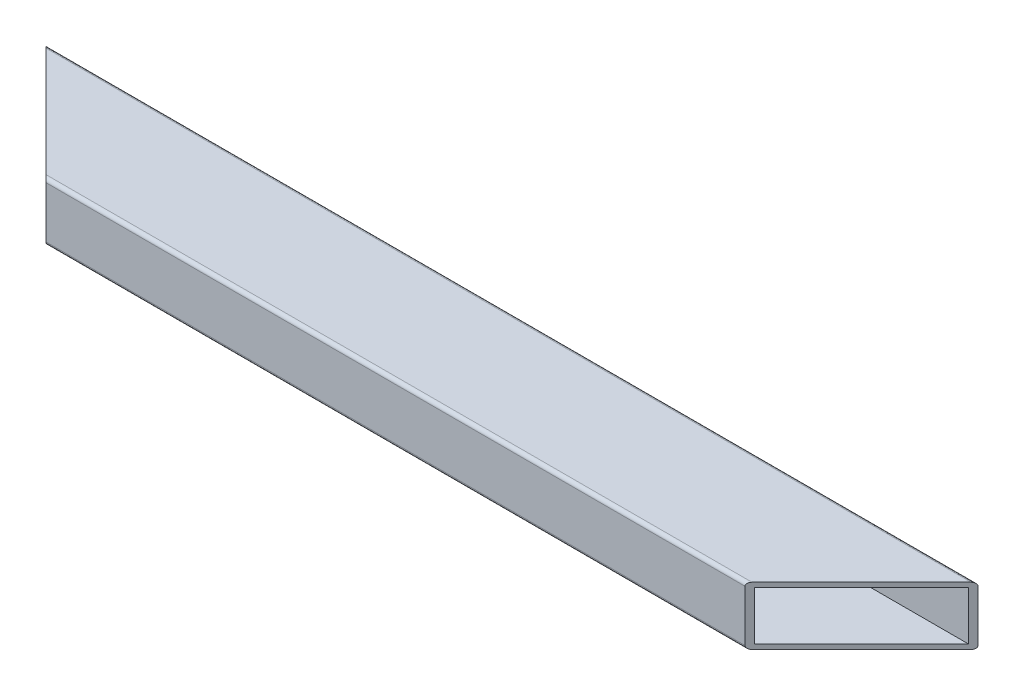
ISO-10303-21;
HEADER;
FILE_DESCRIPTION(('STEP AP214'),'2;1');
FILE_NAME('part.step','',(''),(''),'','','');
FILE_SCHEMA(('AUTOMOTIVE_DESIGN { 1 0 10303 214 1 1 1 1 }'));
ENDSEC;
DATA;
#1=APPLICATION_CONTEXT('core data for automotive mechanical design processes');
#2=APPLICATION_PROTOCOL_DEFINITION('international standard','automotive_design',2000,#1);
#3=PRODUCT_CONTEXT('',#1,'mechanical');
#4=PRODUCT('Part','Part','',(#3));
#5=PRODUCT_RELATED_PRODUCT_CATEGORY('part','',(#4));
#6=PRODUCT_DEFINITION_FORMATION('','',#4);
#7=PRODUCT_DEFINITION_CONTEXT('part definition',#1,'design');
#8=PRODUCT_DEFINITION('design','',#6,#7);
#9=PRODUCT_DEFINITION_SHAPE('','',#8);
#10=(LENGTH_UNIT() NAMED_UNIT(*) SI_UNIT(.MILLI.,.METRE.));
#11=(NAMED_UNIT(*) PLANE_ANGLE_UNIT() SI_UNIT($,.RADIAN.));
#12=(NAMED_UNIT(*) SI_UNIT($,.STERADIAN.) SOLID_ANGLE_UNIT());
#13=UNCERTAINTY_MEASURE_WITH_UNIT(LENGTH_MEASURE(1.E-05),#10,'distance_accuracy_value','');
#14=(GEOMETRIC_REPRESENTATION_CONTEXT(3) GLOBAL_UNCERTAINTY_ASSIGNED_CONTEXT((#13)) GLOBAL_UNIT_ASSIGNED_CONTEXT((#10,
#11,#12)) REPRESENTATION_CONTEXT('',''));
#15=CARTESIAN_POINT('',(0.,0.,0.));
#16=DIRECTION('',(0.,0.,1.));
#17=DIRECTION('',(1.,0.,0.));
#18=AXIS2_PLACEMENT_3D('',#15,#16,#17);
#19=CARTESIAN_POINT('',(762.,-11.,23.5));
#20=DIRECTION('',(-1.,0.,0.));
#21=DIRECTION('',(0.,0.,1.));
#22=AXIS2_PLACEMENT_3D('',#19,#20,#21);
#23=CYLINDRICAL_SURFACE('',#22,1.5);
#24=DIRECTION('',(-1.,0.,0.));
#25=VECTOR('',#24,1.);
#26=CARTESIAN_POINT('',(762.,-12.5,23.5));
#27=LINE('',#26,#25);
#28=CARTESIAN_POINT('',(151.499999999999,-12.5,23.5));
#29=VERTEX_POINT('',#28);
#30=CARTESIAN_POINT('',(-151.5,-12.5,23.4999999999999));
#31=VERTEX_POINT('',#30);
#32=EDGE_CURVE('E218',#29,#31,#27,.T.);
#33=ORIENTED_EDGE('',*,*,#32,.F.);
#34=CARTESIAN_POINT('',(151.499999999999,-11.,23.5));
#35=DIRECTION('',(-0.707106781186544,0.,-0.707106781186551));
#36=DIRECTION('',(-0.707106781186551,0.,0.707106781186544));
#37=AXIS2_PLACEMENT_3D('',#34,#35,#36);
#38=ELLIPSE('',#37,2.12132034355965,1.5);
#39=CARTESIAN_POINT('',(149.999999999999,-11.,25.));
#40=VERTEX_POINT('',#39);
#41=EDGE_CURVE('E165',#29,#40,#38,.T.);
#42=ORIENTED_EDGE('',*,*,#41,.T.);
#43=DIRECTION('',(-1.,0.,0.));
#44=VECTOR('',#43,1.);
#45=CARTESIAN_POINT('',(762.,-11.,25.));
#46=LINE('',#45,#44);
#47=CARTESIAN_POINT('',(-150.,-11.,25.));
#48=VERTEX_POINT('',#47);
#49=EDGE_CURVE('E203',#40,#48,#46,.T.);
#50=ORIENTED_EDGE('',*,*,#49,.T.);
#51=CARTESIAN_POINT('',(-151.5,-11.,23.5));
#52=DIRECTION('',(-0.707106781186544,0.,0.707106781186551));
#53=DIRECTION('',(-0.707106781186551,0.,-0.707106781186544));
#54=AXIS2_PLACEMENT_3D('',#51,#52,#53);
#55=ELLIPSE('',#54,2.12132034355965,1.5);
#56=EDGE_CURVE('E133',#31,#48,#55,.T.);
#57=ORIENTED_EDGE('',*,*,#56,.F.);
#58=EDGE_LOOP('',(#33,#42,#50,#57));
#59=FACE_BOUND('',#58,.T.);
#60=ADVANCED_FACE('F37',(#59),#23,.T.);
#61=CARTESIAN_POINT('',(762.,-12.5,23.5));
#62=DIRECTION('',(0.,1.,0.));
#63=DIRECTION('',(0.,0.,1.));
#64=AXIS2_PLACEMENT_3D('',#61,#62,#63);
#65=PLANE('',#64);
#66=DIRECTION('',(-1.,0.,0.));
#67=VECTOR('',#66,1.);
#68=CARTESIAN_POINT('',(762.,-12.5,-23.5));
#69=LINE('',#68,#67);
#70=CARTESIAN_POINT('',(198.5,-12.5,-23.5));
#71=VERTEX_POINT('',#70);
#72=CARTESIAN_POINT('',(-198.5,-12.5,-23.5));
#73=VERTEX_POINT('',#72);
#74=EDGE_CURVE('E216',#71,#73,#69,.T.);
#75=ORIENTED_EDGE('',*,*,#74,.F.);
#76=DIRECTION('',(-0.707106781186551,0.,0.707106781186544));
#77=VECTOR('',#76,1.);
#78=CARTESIAN_POINT('',(456.750000000003,-12.5,-281.75));
#79=LINE('',#78,#77);
#80=EDGE_CURVE('E162',#71,#29,#79,.T.);
#81=ORIENTED_EDGE('',*,*,#80,.T.);
#82=ORIENTED_EDGE('',*,*,#32,.T.);
#83=DIRECTION('',(0.707106781186551,0.,0.707106781186544));
#84=VECTOR('',#83,1.);
#85=CARTESIAN_POINT('',(305.250000000005,-12.5,480.25));
#86=LINE('',#85,#84);
#87=EDGE_CURVE('E194',#73,#31,#86,.T.);
#88=ORIENTED_EDGE('',*,*,#87,.F.);
#89=EDGE_LOOP('',(#75,#81,#82,#88));
#90=FACE_BOUND('',#89,.T.);
#91=ADVANCED_FACE('F224',(#90),#65,.F.);
#92=CARTESIAN_POINT('',(762.,-11.,-23.5));
#93=DIRECTION('',(-1.,0.,0.));
#94=DIRECTION('',(0.,0.,1.));
#95=AXIS2_PLACEMENT_3D('',#92,#93,#94);
#96=CYLINDRICAL_SURFACE('',#95,1.5);
#97=DIRECTION('',(-1.,0.,0.));
#98=VECTOR('',#97,1.);
#99=CARTESIAN_POINT('',(762.,-11.,-25.));
#100=LINE('',#99,#98);
#101=CARTESIAN_POINT('',(200.,-11.,-25.));
#102=VERTEX_POINT('',#101);
#103=CARTESIAN_POINT('',(-200.,-11.,-25.));
#104=VERTEX_POINT('',#103);
#105=EDGE_CURVE('E214',#102,#104,#100,.T.);
#106=ORIENTED_EDGE('',*,*,#105,.F.);
#107=CARTESIAN_POINT('',(198.5,-11.,-23.5));
#108=DIRECTION('',(-0.707106781186544,0.,-0.707106781186551));
#109=DIRECTION('',(-0.707106781186551,0.,0.707106781186544));
#110=AXIS2_PLACEMENT_3D('',#107,#108,#109);
#111=ELLIPSE('',#110,2.12132034355965,1.5);
#112=EDGE_CURVE('E159',#102,#71,#111,.T.);
#113=ORIENTED_EDGE('',*,*,#112,.T.);
#114=ORIENTED_EDGE('',*,*,#74,.T.);
#115=CARTESIAN_POINT('',(-198.5,-11.,-23.5));
#116=DIRECTION('',(-0.707106781186544,0.,0.707106781186551));
#117=DIRECTION('',(-0.707106781186551,0.,-0.707106781186544));
#118=AXIS2_PLACEMENT_3D('',#115,#116,#117);
#119=ELLIPSE('',#118,2.12132034355965,1.5);
#120=EDGE_CURVE('E191',#104,#73,#119,.T.);
#121=ORIENTED_EDGE('',*,*,#120,.F.);
#122=EDGE_LOOP('',(#106,#113,#114,#121));
#123=FACE_BOUND('',#122,.T.);
#124=ADVANCED_FACE('F234',(#123),#96,.T.);
#125=CARTESIAN_POINT('',(762.,11.,-25.));
#126=DIRECTION('',(0.,0.,1.));
#127=DIRECTION('',(0.,-1.,0.));
#128=AXIS2_PLACEMENT_3D('',#125,#126,#127);
#129=PLANE('',#128);
#130=DIRECTION('',(-1.,0.,0.));
#131=VECTOR('',#130,1.);
#132=CARTESIAN_POINT('',(762.,11.,-25.));
#133=LINE('',#132,#131);
#134=CARTESIAN_POINT('',(200.,11.,-25.));
#135=VERTEX_POINT('',#134);
#136=CARTESIAN_POINT('',(-200.,11.,-25.));
#137=VERTEX_POINT('',#136);
#138=EDGE_CURVE('E212',#135,#137,#133,.T.);
#139=ORIENTED_EDGE('',*,*,#138,.F.);
#140=DIRECTION('',(0.,-1.,0.));
#141=VECTOR('',#140,1.);
#142=CARTESIAN_POINT('',(200.,10.9999999999998,-25.));
#143=LINE('',#142,#141);
#144=EDGE_CURVE('E156',#135,#102,#143,.T.);
#145=ORIENTED_EDGE('',*,*,#144,.T.);
#146=ORIENTED_EDGE('',*,*,#105,.T.);
#147=DIRECTION('',(0.,-1.,0.));
#148=VECTOR('',#147,1.);
#149=CARTESIAN_POINT('',(-200.,11.0000000000003,-25.));
#150=LINE('',#149,#148);
#151=EDGE_CURVE('E188',#137,#104,#150,.T.);
#152=ORIENTED_EDGE('',*,*,#151,.F.);
#153=EDGE_LOOP('',(#139,#145,#146,#152));
#154=FACE_BOUND('',#153,.T.);
#155=ADVANCED_FACE('F237',(#154),#129,.F.);
#156=CARTESIAN_POINT('',(762.,11.,-23.5));
#157=DIRECTION('',(-1.,0.,0.));
#158=DIRECTION('',(0.,0.,1.));
#159=AXIS2_PLACEMENT_3D('',#156,#157,#158);
#160=CYLINDRICAL_SURFACE('',#159,1.5);
#161=DIRECTION('',(-1.,0.,0.));
#162=VECTOR('',#161,1.);
#163=CARTESIAN_POINT('',(762.,12.5,-23.5));
#164=LINE('',#163,#162);
#165=CARTESIAN_POINT('',(198.5,12.5,-23.5));
#166=VERTEX_POINT('',#165);
#167=CARTESIAN_POINT('',(-198.5,12.5,-23.5));
#168=VERTEX_POINT('',#167);
#169=EDGE_CURVE('E210',#166,#168,#164,.T.);
#170=ORIENTED_EDGE('',*,*,#169,.F.);
#171=CARTESIAN_POINT('',(198.5,11.,-23.5));
#172=DIRECTION('',(-0.707106781186544,0.,-0.707106781186551));
#173=DIRECTION('',(-0.707106781186551,0.,0.707106781186544));
#174=AXIS2_PLACEMENT_3D('',#171,#172,#173);
#175=ELLIPSE('',#174,2.12132034355965,1.5);
#176=EDGE_CURVE('E153',#166,#135,#175,.T.);
#177=ORIENTED_EDGE('',*,*,#176,.T.);
#178=ORIENTED_EDGE('',*,*,#138,.T.);
#179=CARTESIAN_POINT('',(-198.5,11.,-23.5));
#180=DIRECTION('',(-0.707106781186544,0.,0.707106781186551));
#181=DIRECTION('',(-0.707106781186551,0.,-0.707106781186544));
#182=AXIS2_PLACEMENT_3D('',#179,#180,#181);
#183=ELLIPSE('',#182,2.12132034355965,1.5);
#184=EDGE_CURVE('E185',#168,#137,#183,.T.);
#185=ORIENTED_EDGE('',*,*,#184,.F.);
#186=EDGE_LOOP('',(#170,#177,#178,#185));
#187=FACE_BOUND('',#186,.T.);
#188=ADVANCED_FACE('F241',(#187),#160,.T.);
#189=CARTESIAN_POINT('',(762.,12.5,23.5));
#190=DIRECTION('',(0.,-1.,0.));
#191=DIRECTION('',(0.,0.,-1.));
#192=AXIS2_PLACEMENT_3D('',#189,#190,#191);
#193=PLANE('',#192);
#194=DIRECTION('',(-1.,0.,0.));
#195=VECTOR('',#194,1.);
#196=CARTESIAN_POINT('',(762.,12.5,23.5));
#197=LINE('',#196,#195);
#198=CARTESIAN_POINT('',(151.499999999999,12.5,23.5));
#199=VERTEX_POINT('',#198);
#200=CARTESIAN_POINT('',(-151.5,12.5,23.5));
#201=VERTEX_POINT('',#200);
#202=EDGE_CURVE('E208',#199,#201,#197,.T.);
#203=ORIENTED_EDGE('',*,*,#202,.F.);
#204=DIRECTION('',(0.707106781186551,0.,-0.707106781186544));
#205=VECTOR('',#204,1.);
#206=CARTESIAN_POINT('',(456.750000000003,12.5,-281.75));
#207=LINE('',#206,#205);
#208=EDGE_CURVE('E150',#199,#166,#207,.T.);
#209=ORIENTED_EDGE('',*,*,#208,.T.);
#210=ORIENTED_EDGE('',*,*,#169,.T.);
#211=DIRECTION('',(-0.707106781186551,0.,-0.707106781186544));
#212=VECTOR('',#211,1.);
#213=CARTESIAN_POINT('',(305.250000000005,12.5,480.25));
#214=LINE('',#213,#212);
#215=EDGE_CURVE('E182',#201,#168,#214,.T.);
#216=ORIENTED_EDGE('',*,*,#215,.F.);
#217=EDGE_LOOP('',(#203,#209,#210,#216));
#218=FACE_BOUND('',#217,.T.);
#219=ADVANCED_FACE('F244',(#218),#193,.F.);
#220=CARTESIAN_POINT('',(762.,11.,23.5));
#221=DIRECTION('',(-1.,0.,0.));
#222=DIRECTION('',(0.,0.,1.));
#223=AXIS2_PLACEMENT_3D('',#220,#221,#222);
#224=CYLINDRICAL_SURFACE('',#223,1.5);
#225=DIRECTION('',(-1.,0.,0.));
#226=VECTOR('',#225,1.);
#227=CARTESIAN_POINT('',(762.,11.,25.));
#228=LINE('',#227,#226);
#229=CARTESIAN_POINT('',(149.999999999999,11.,25.));
#230=VERTEX_POINT('',#229);
#231=CARTESIAN_POINT('',(-150.,11.,25.));
#232=VERTEX_POINT('',#231);
#233=EDGE_CURVE('E206',#230,#232,#228,.T.);
#234=ORIENTED_EDGE('',*,*,#233,.F.);
#235=CARTESIAN_POINT('',(151.499999999999,11.,23.5));
#236=DIRECTION('',(-0.707106781186544,0.,-0.707106781186551));
#237=DIRECTION('',(-0.707106781186551,0.,0.707106781186544));
#238=AXIS2_PLACEMENT_3D('',#235,#236,#237);
#239=ELLIPSE('',#238,2.12132034355965,1.5);
#240=EDGE_CURVE('E51',#230,#199,#239,.T.);
#241=ORIENTED_EDGE('',*,*,#240,.T.);
#242=ORIENTED_EDGE('',*,*,#202,.T.);
#243=CARTESIAN_POINT('',(-151.5,11.,23.5));
#244=DIRECTION('',(-0.707106781186544,0.,0.707106781186551));
#245=DIRECTION('',(-0.707106781186551,0.,-0.707106781186544));
#246=AXIS2_PLACEMENT_3D('',#243,#244,#245);
#247=ELLIPSE('',#246,2.12132034355965,1.5);
#248=EDGE_CURVE('E179',#232,#201,#247,.T.);
#249=ORIENTED_EDGE('',*,*,#248,.F.);
#250=EDGE_LOOP('',(#234,#241,#242,#249));
#251=FACE_BOUND('',#250,.T.);
#252=ADVANCED_FACE('F249',(#251),#224,.T.);
#253=CARTESIAN_POINT('',(762.,11.,25.));
#254=DIRECTION('',(0.,0.,-1.));
#255=DIRECTION('',(0.,1.,0.));
#256=AXIS2_PLACEMENT_3D('',#253,#254,#255);
#257=PLANE('',#256);
#258=ORIENTED_EDGE('',*,*,#49,.F.);
#259=DIRECTION('',(0.,1.,0.));
#260=VECTOR('',#259,1.);
#261=CARTESIAN_POINT('',(149.999999999999,10.9999999999999,25.));
#262=LINE('',#261,#260);
#263=EDGE_CURVE('E144',#40,#230,#262,.T.);
#264=ORIENTED_EDGE('',*,*,#263,.T.);
#265=ORIENTED_EDGE('',*,*,#233,.T.);
#266=DIRECTION('',(0.,1.,0.));
#267=VECTOR('',#266,1.);
#268=CARTESIAN_POINT('',(-150.,11.0000000000001,25.));
#269=LINE('',#268,#267);
#270=EDGE_CURVE('E176',#48,#232,#269,.T.);
#271=ORIENTED_EDGE('',*,*,#270,.F.);
#272=EDGE_LOOP('',(#258,#264,#265,#271));
#273=FACE_BOUND('',#272,.T.);
#274=ADVANCED_FACE('F251',(#273),#257,.F.);
#275=CARTESIAN_POINT('',(762.,-10.5,23.5));
#276=DIRECTION('',(0.,1.,0.));
#277=DIRECTION('',(0.,0.,1.));
#278=AXIS2_PLACEMENT_3D('',#275,#276,#277);
#279=PLANE('',#278);
#280=DIRECTION('',(-0.707106781186551,0.,0.707106781186544));
#281=VECTOR('',#280,1.);
#282=CARTESIAN_POINT('',(456.750000000003,-10.5,-281.75));
#283=LINE('',#282,#281);
#284=CARTESIAN_POINT('',(198.,-10.5,-23.));
#285=VERTEX_POINT('',#284);
#286=CARTESIAN_POINT('',(151.999999999999,-10.5,23.));
#287=VERTEX_POINT('',#286);
#288=EDGE_CURVE('E59',#285,#287,#283,.T.);
#289=ORIENTED_EDGE('',*,*,#288,.F.);
#290=DIRECTION('',(-1.,0.,0.));
#291=VECTOR('',#290,1.);
#292=CARTESIAN_POINT('',(762.,-10.5,-23.));
#293=LINE('',#292,#291);
#294=CARTESIAN_POINT('',(-198.,-10.5,-23.));
#295=VERTEX_POINT('',#294);
#296=EDGE_CURVE('E199',#285,#295,#293,.T.);
#297=ORIENTED_EDGE('',*,*,#296,.T.);
#298=DIRECTION('',(0.707106781186551,0.,0.707106781186544));
#299=VECTOR('',#298,1.);
#300=CARTESIAN_POINT('',(305.250000000005,-10.5,480.25));
#301=LINE('',#300,#299);
#302=CARTESIAN_POINT('',(-152.,-10.5,23.));
#303=VERTEX_POINT('',#302);
#304=EDGE_CURVE('E173',#295,#303,#301,.T.);
#305=ORIENTED_EDGE('',*,*,#304,.T.);
#306=DIRECTION('',(-1.,0.,0.));
#307=VECTOR('',#306,1.);
#308=CARTESIAN_POINT('',(762.,-10.5,23.));
#309=LINE('',#308,#307);
#310=EDGE_CURVE('E201',#287,#303,#309,.T.);
#311=ORIENTED_EDGE('',*,*,#310,.F.);
#312=EDGE_LOOP('',(#289,#297,#305,#311));
#313=FACE_BOUND('',#312,.T.);
#314=ADVANCED_FACE('F253',(#313),#279,.T.);
#315=CARTESIAN_POINT('',(762.,11.,-23.));
#316=DIRECTION('',(0.,0.,1.));
#317=DIRECTION('',(0.,-1.,0.));
#318=AXIS2_PLACEMENT_3D('',#315,#316,#317);
#319=PLANE('',#318);
#320=DIRECTION('',(0.,-1.,0.));
#321=VECTOR('',#320,1.);
#322=CARTESIAN_POINT('',(198.,10.9999999999998,-23.));
#323=LINE('',#322,#321);
#324=CARTESIAN_POINT('',(198.,10.5,-23.));
#325=VERTEX_POINT('',#324);
#326=EDGE_CURVE('E141',#325,#285,#323,.T.);
#327=ORIENTED_EDGE('',*,*,#326,.F.);
#328=DIRECTION('',(-1.,0.,0.));
#329=VECTOR('',#328,1.);
#330=CARTESIAN_POINT('',(762.,10.5,-23.));
#331=LINE('',#330,#329);
#332=CARTESIAN_POINT('',(-198.,10.5,-23.0000000000001));
#333=VERTEX_POINT('',#332);
#334=EDGE_CURVE('E132',#325,#333,#331,.T.);
#335=ORIENTED_EDGE('',*,*,#334,.T.);
#336=DIRECTION('',(0.,-1.,0.));
#337=VECTOR('',#336,1.);
#338=CARTESIAN_POINT('',(-198.,11.0000000000003,-23.));
#339=LINE('',#338,#337);
#340=EDGE_CURVE('E170',#333,#295,#339,.T.);
#341=ORIENTED_EDGE('',*,*,#340,.T.);
#342=ORIENTED_EDGE('',*,*,#296,.F.);
#343=EDGE_LOOP('',(#327,#335,#341,#342));
#344=FACE_BOUND('',#343,.T.);
#345=ADVANCED_FACE('F259',(#344),#319,.T.);
#346=CARTESIAN_POINT('',(762.,10.5,23.5));
#347=DIRECTION('',(0.,-1.,0.));
#348=DIRECTION('',(0.,0.,-1.));
#349=AXIS2_PLACEMENT_3D('',#346,#347,#348);
#350=PLANE('',#349);
#351=DIRECTION('',(0.707106781186551,0.,-0.707106781186544));
#352=VECTOR('',#351,1.);
#353=CARTESIAN_POINT('',(456.750000000003,10.5,-281.75));
#354=LINE('',#353,#352);
#355=CARTESIAN_POINT('',(151.999999999999,10.5,23.));
#356=VERTEX_POINT('',#355);
#357=EDGE_CURVE('E137',#356,#325,#354,.T.);
#358=ORIENTED_EDGE('',*,*,#357,.F.);
#359=DIRECTION('',(-1.,0.,0.));
#360=VECTOR('',#359,1.);
#361=CARTESIAN_POINT('',(762.,10.5,23.));
#362=LINE('',#361,#360);
#363=CARTESIAN_POINT('',(-152.,10.5,23.));
#364=VERTEX_POINT('',#363);
#365=EDGE_CURVE('E125',#356,#364,#362,.T.);
#366=ORIENTED_EDGE('',*,*,#365,.T.);
#367=DIRECTION('',(-0.707106781186551,0.,-0.707106781186544));
#368=VECTOR('',#367,1.);
#369=CARTESIAN_POINT('',(305.250000000005,10.5,480.25));
#370=LINE('',#369,#368);
#371=EDGE_CURVE('E168',#364,#333,#370,.T.);
#372=ORIENTED_EDGE('',*,*,#371,.T.);
#373=ORIENTED_EDGE('',*,*,#334,.F.);
#374=EDGE_LOOP('',(#358,#366,#372,#373));
#375=FACE_BOUND('',#374,.T.);
#376=ADVANCED_FACE('F138',(#375),#350,.T.);
#377=CARTESIAN_POINT('',(762.,11.,23.));
#378=DIRECTION('',(0.,0.,-1.));
#379=DIRECTION('',(0.,1.,0.));
#380=AXIS2_PLACEMENT_3D('',#377,#378,#379);
#381=PLANE('',#380);
#382=DIRECTION('',(0.,1.,0.));
#383=VECTOR('',#382,1.);
#384=CARTESIAN_POINT('',(151.999999999999,10.9999999999999,23.));
#385=LINE('',#384,#383);
#386=EDGE_CURVE('E12',#287,#356,#385,.T.);
#387=ORIENTED_EDGE('',*,*,#386,.F.);
#388=ORIENTED_EDGE('',*,*,#310,.T.);
#389=DIRECTION('',(0.,1.,0.));
#390=VECTOR('',#389,1.);
#391=CARTESIAN_POINT('',(-152.,11.0000000000001,23.));
#392=LINE('',#391,#390);
#393=EDGE_CURVE('E44',#303,#364,#392,.T.);
#394=ORIENTED_EDGE('',*,*,#393,.T.);
#395=ORIENTED_EDGE('',*,*,#365,.F.);
#396=EDGE_LOOP('',(#387,#388,#394,#395));
#397=FACE_BOUND('',#396,.T.);
#398=ADVANCED_FACE('F127',(#397),#381,.T.);
#399=CARTESIAN_POINT('',(-87.499999999999,0.,87.4999999999999));
#400=DIRECTION('',(-0.707106781186544,0.,0.707106781186551));
#401=DIRECTION('',(0.707106781186551,0.,0.707106781186544));
#402=AXIS2_PLACEMENT_3D('',#399,#400,#401);
#403=PLANE('',#402);
#404=ORIENTED_EDGE('',*,*,#304,.F.);
#405=ORIENTED_EDGE('',*,*,#340,.F.);
#406=ORIENTED_EDGE('',*,*,#371,.F.);
#407=ORIENTED_EDGE('',*,*,#393,.F.);
#408=EDGE_LOOP('',(#404,#405,#406,#407));
#409=FACE_BOUND('',#408,.T.);
#410=ORIENTED_EDGE('',*,*,#87,.T.);
#411=ORIENTED_EDGE('',*,*,#56,.T.);
#412=ORIENTED_EDGE('',*,*,#270,.T.);
#413=ORIENTED_EDGE('',*,*,#248,.T.);
#414=ORIENTED_EDGE('',*,*,#215,.T.);
#415=ORIENTED_EDGE('',*,*,#184,.T.);
#416=ORIENTED_EDGE('',*,*,#151,.T.);
#417=ORIENTED_EDGE('',*,*,#120,.T.);
#418=EDGE_LOOP('',(#410,#411,#412,#413,#414,#415,#416,#417));
#419=FACE_BOUND('',#418,.T.);
#420=ADVANCED_FACE('F229',(#409,#419),#403,.T.);
#421=CARTESIAN_POINT('',(87.499999999999,0.,87.4999999999999));
#422=DIRECTION('',(-0.707106781186544,0.,-0.707106781186551));
#423=DIRECTION('',(-0.707106781186551,0.,0.707106781186544));
#424=AXIS2_PLACEMENT_3D('',#421,#422,#423);
#425=PLANE('',#424);
#426=ORIENTED_EDGE('',*,*,#326,.T.);
#427=ORIENTED_EDGE('',*,*,#288,.T.);
#428=ORIENTED_EDGE('',*,*,#386,.T.);
#429=ORIENTED_EDGE('',*,*,#357,.T.);
#430=EDGE_LOOP('',(#426,#427,#428,#429));
#431=FACE_BOUND('',#430,.T.);
#432=ORIENTED_EDGE('',*,*,#41,.F.);
#433=ORIENTED_EDGE('',*,*,#80,.F.);
#434=ORIENTED_EDGE('',*,*,#112,.F.);
#435=ORIENTED_EDGE('',*,*,#144,.F.);
#436=ORIENTED_EDGE('',*,*,#176,.F.);
#437=ORIENTED_EDGE('',*,*,#208,.F.);
#438=ORIENTED_EDGE('',*,*,#240,.F.);
#439=ORIENTED_EDGE('',*,*,#263,.F.);
#440=EDGE_LOOP('',(#432,#433,#434,#435,#436,#437,#438,#439));
#441=FACE_BOUND('',#440,.T.);
#442=ADVANCED_FACE('F143',(#431,#441),#425,.F.);
#443=CLOSED_SHELL('',(#60,#91,#124,#155,#188,#219,#252,#274,#314,#345,#376,#398,#420,#442));
#444=MANIFOLD_SOLID_BREP('B2',#443);
#445=ADVANCED_BREP_SHAPE_REPRESENTATION('',(#18,#444),#14);
#446=SHAPE_DEFINITION_REPRESENTATION(#9,#445);
ENDSEC;
END-ISO-10303-21;
